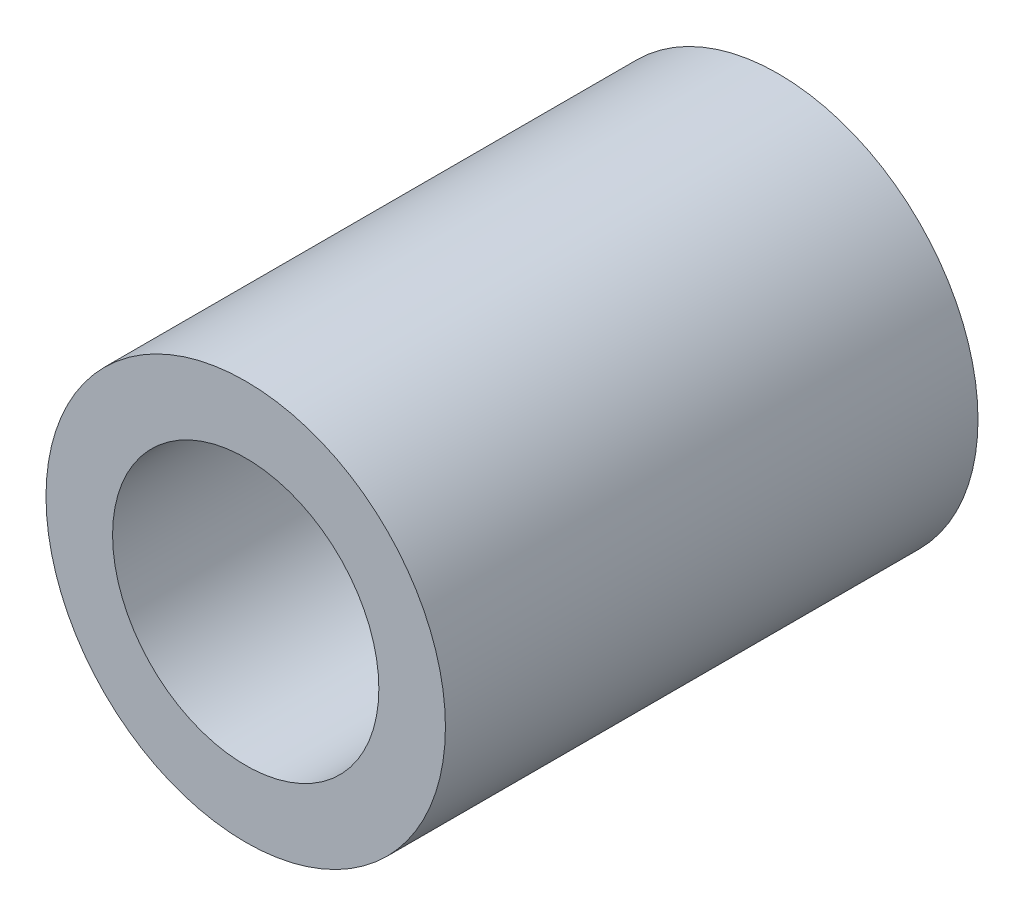
ISO-10303-21;
HEADER;
FILE_DESCRIPTION(('STEP AP214'),'2;1');
FILE_NAME('part.step','',(''),(''),'','','');
FILE_SCHEMA(('AUTOMOTIVE_DESIGN { 1 0 10303 214 1 1 1 1 }'));
ENDSEC;
DATA;
#1=APPLICATION_CONTEXT('core data for automotive mechanical design processes');
#2=APPLICATION_PROTOCOL_DEFINITION('international standard','automotive_design',2000,#1);
#3=PRODUCT_CONTEXT('',#1,'mechanical');
#4=PRODUCT('Part','Part','',(#3));
#5=PRODUCT_RELATED_PRODUCT_CATEGORY('part','',(#4));
#6=PRODUCT_DEFINITION_FORMATION('','',#4);
#7=PRODUCT_DEFINITION_CONTEXT('part definition',#1,'design');
#8=PRODUCT_DEFINITION('design','',#6,#7);
#9=PRODUCT_DEFINITION_SHAPE('','',#8);
#10=(LENGTH_UNIT() NAMED_UNIT(*) SI_UNIT(.MILLI.,.METRE.));
#11=(NAMED_UNIT(*) PLANE_ANGLE_UNIT() SI_UNIT($,.RADIAN.));
#12=(NAMED_UNIT(*) SI_UNIT($,.STERADIAN.) SOLID_ANGLE_UNIT());
#13=UNCERTAINTY_MEASURE_WITH_UNIT(LENGTH_MEASURE(1.E-05),#10,'distance_accuracy_value','');
#14=(GEOMETRIC_REPRESENTATION_CONTEXT(3) GLOBAL_UNCERTAINTY_ASSIGNED_CONTEXT((#13)) GLOBAL_UNIT_ASSIGNED_CONTEXT((#10,
#11,#12)) REPRESENTATION_CONTEXT('',''));
#15=CARTESIAN_POINT('',(0.,0.,0.));
#16=DIRECTION('',(0.,0.,1.));
#17=DIRECTION('',(1.,0.,0.));
#18=AXIS2_PLACEMENT_3D('',#15,#16,#17);
#19=CARTESIAN_POINT('',(0.,0.,8.));
#20=DIRECTION('',(0.,0.,-1.));
#21=DIRECTION('',(-1.,0.,0.));
#22=AXIS2_PLACEMENT_3D('',#19,#20,#21);
#23=CYLINDRICAL_SURFACE('',#22,3.);
#24=CARTESIAN_POINT('',(0.,0.,8.));
#25=DIRECTION('',(0.,0.,1.));
#26=DIRECTION('',(1.,0.,0.));
#27=AXIS2_PLACEMENT_3D('',#24,#25,#26);
#28=CIRCLE('',#27,3.);
#29=CARTESIAN_POINT('',(3.,0.,8.));
#30=VERTEX_POINT('',#29);
#31=EDGE_CURVE('E10',#30,#30,#28,.T.);
#32=ORIENTED_EDGE('',*,*,#31,.F.);
#33=EDGE_LOOP('',(#32));
#34=FACE_BOUND('',#33,.T.);
#35=CARTESIAN_POINT('',(0.,0.,0.));
#36=DIRECTION('',(0.,0.,1.));
#37=DIRECTION('',(1.,0.,0.));
#38=AXIS2_PLACEMENT_3D('',#35,#36,#37);
#39=CIRCLE('',#38,3.);
#40=CARTESIAN_POINT('',(3.,0.,0.));
#41=VERTEX_POINT('',#40);
#42=EDGE_CURVE('E42',#41,#41,#39,.T.);
#43=ORIENTED_EDGE('',*,*,#42,.T.);
#44=EDGE_LOOP('',(#43));
#45=FACE_BOUND('',#44,.T.);
#46=ADVANCED_FACE('F39',(#34,#45),#23,.T.);
#47=CARTESIAN_POINT('',(0.,0.,8.));
#48=DIRECTION('',(0.,0.,1.));
#49=DIRECTION('',(1.,0.,0.));
#50=AXIS2_PLACEMENT_3D('',#47,#48,#49);
#51=PLANE('',#50);
#52=CARTESIAN_POINT('',(0.,0.,8.));
#53=DIRECTION('',(0.,0.,1.));
#54=DIRECTION('',(1.,0.,0.));
#55=AXIS2_PLACEMENT_3D('',#52,#53,#54);
#56=CIRCLE('',#55,2.);
#57=CARTESIAN_POINT('',(2.,0.,8.));
#58=VERTEX_POINT('',#57);
#59=EDGE_CURVE('E51',#58,#58,#56,.T.);
#60=ORIENTED_EDGE('',*,*,#59,.F.);
#61=EDGE_LOOP('',(#60));
#62=FACE_BOUND('',#61,.T.);
#63=ORIENTED_EDGE('',*,*,#31,.T.);
#64=EDGE_LOOP('',(#63));
#65=FACE_BOUND('',#64,.T.);
#66=ADVANCED_FACE('F66',(#62,#65),#51,.T.);
#67=CARTESIAN_POINT('',(0.,0.,0.));
#68=DIRECTION('',(0.,0.,1.));
#69=DIRECTION('',(1.,0.,0.));
#70=AXIS2_PLACEMENT_3D('',#67,#68,#69);
#71=PLANE('',#70);
#72=CARTESIAN_POINT('',(0.,0.,0.));
#73=DIRECTION('',(0.,0.,1.));
#74=DIRECTION('',(1.,0.,0.));
#75=AXIS2_PLACEMENT_3D('',#72,#73,#74);
#76=CIRCLE('',#75,2.);
#77=CARTESIAN_POINT('',(2.,0.,0.));
#78=VERTEX_POINT('',#77);
#79=EDGE_CURVE('E49',#78,#78,#76,.T.);
#80=ORIENTED_EDGE('',*,*,#79,.T.);
#81=EDGE_LOOP('',(#80));
#82=FACE_BOUND('',#81,.T.);
#83=ORIENTED_EDGE('',*,*,#42,.F.);
#84=EDGE_LOOP('',(#83));
#85=FACE_BOUND('',#84,.T.);
#86=ADVANCED_FACE('F57',(#82,#85),#71,.F.);
#87=CARTESIAN_POINT('',(0.,0.,0.));
#88=DIRECTION('',(0.,0.,1.));
#89=DIRECTION('',(1.,0.,0.));
#90=AXIS2_PLACEMENT_3D('',#87,#88,#89);
#91=CYLINDRICAL_SURFACE('',#90,2.);
#92=ORIENTED_EDGE('',*,*,#79,.F.);
#93=EDGE_LOOP('',(#92));
#94=FACE_BOUND('',#93,.T.);
#95=ORIENTED_EDGE('',*,*,#59,.T.);
#96=EDGE_LOOP('',(#95));
#97=FACE_BOUND('',#96,.T.);
#98=ADVANCED_FACE('F60',(#94,#97),#91,.F.);
#99=CLOSED_SHELL('',(#46,#66,#86,#98));
#100=MANIFOLD_SOLID_BREP('B2',#99);
#101=ADVANCED_BREP_SHAPE_REPRESENTATION('',(#18,#100),#14);
#102=SHAPE_DEFINITION_REPRESENTATION(#9,#101);
ENDSEC;
END-ISO-10303-21;
